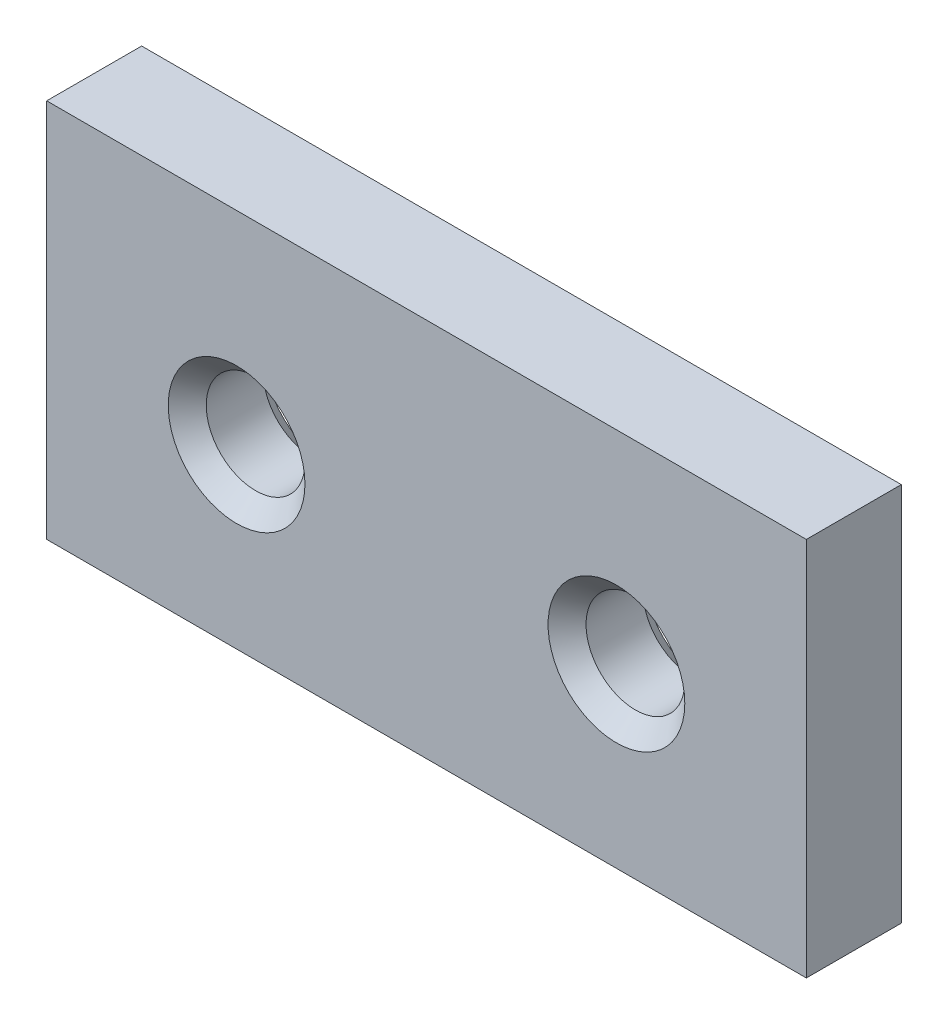
ISO-10303-21;
HEADER;
FILE_DESCRIPTION(('STEP AP214'),'2;1');
FILE_NAME('part.step','',(''),(''),'','','');
FILE_SCHEMA(('AUTOMOTIVE_DESIGN { 1 0 10303 214 1 1 1 1 }'));
ENDSEC;
DATA;
#1=APPLICATION_CONTEXT('core data for automotive mechanical design processes');
#2=APPLICATION_PROTOCOL_DEFINITION('international standard','automotive_design',2000,#1);
#3=PRODUCT_CONTEXT('',#1,'mechanical');
#4=PRODUCT('Part','Part','',(#3));
#5=PRODUCT_RELATED_PRODUCT_CATEGORY('part','',(#4));
#6=PRODUCT_DEFINITION_FORMATION('','',#4);
#7=PRODUCT_DEFINITION_CONTEXT('part definition',#1,'design');
#8=PRODUCT_DEFINITION('design','',#6,#7);
#9=PRODUCT_DEFINITION_SHAPE('','',#8);
#10=(LENGTH_UNIT() NAMED_UNIT(*) SI_UNIT(.MILLI.,.METRE.));
#11=(NAMED_UNIT(*) PLANE_ANGLE_UNIT() SI_UNIT($,.RADIAN.));
#12=(NAMED_UNIT(*) SI_UNIT($,.STERADIAN.) SOLID_ANGLE_UNIT());
#13=UNCERTAINTY_MEASURE_WITH_UNIT(LENGTH_MEASURE(1.E-05),#10,'distance_accuracy_value','');
#14=(GEOMETRIC_REPRESENTATION_CONTEXT(3) GLOBAL_UNCERTAINTY_ASSIGNED_CONTEXT((#13)) GLOBAL_UNIT_ASSIGNED_CONTEXT((#10,
#11,#12)) REPRESENTATION_CONTEXT('',''));
#15=CARTESIAN_POINT('',(0.,0.,0.));
#16=DIRECTION('',(0.,0.,1.));
#17=DIRECTION('',(1.,0.,0.));
#18=AXIS2_PLACEMENT_3D('',#15,#16,#17);
#19=CARTESIAN_POINT('',(-71.2982992196035,16.0465116279069,5.));
#20=DIRECTION('',(1.,0.,0.));
#21=DIRECTION('',(0.,0.,-1.));
#22=AXIS2_PLACEMENT_3D('',#19,#20,#21);
#23=PLANE('',#22);
#24=DIRECTION('',(0.,-1.,0.));
#25=VECTOR('',#24,1.);
#26=CARTESIAN_POINT('',(-71.2982992196035,16.0465116279069,0.));
#27=LINE('',#26,#25);
#28=CARTESIAN_POINT('',(-71.2982992196035,16.0465116279069,0.));
#29=VERTEX_POINT('',#28);
#30=CARTESIAN_POINT('',(-71.2982992196035,-3.95348837209306,0.));
#31=VERTEX_POINT('',#30);
#32=EDGE_CURVE('E101',#29,#31,#27,.T.);
#33=ORIENTED_EDGE('',*,*,#32,.T.);
#34=DIRECTION('',(0.,0.,-1.));
#35=VECTOR('',#34,1.);
#36=CARTESIAN_POINT('',(-71.2982992196035,-3.95348837209306,5.));
#37=LINE('',#36,#35);
#38=CARTESIAN_POINT('',(-71.2982992196035,-3.95348837209306,5.));
#39=VERTEX_POINT('',#38);
#40=EDGE_CURVE('E92',#39,#31,#37,.T.);
#41=ORIENTED_EDGE('',*,*,#40,.F.);
#42=DIRECTION('',(0.,-1.,0.));
#43=VECTOR('',#42,1.);
#44=CARTESIAN_POINT('',(-71.2982992196035,16.0465116279069,5.));
#45=LINE('',#44,#43);
#46=CARTESIAN_POINT('',(-71.2982992196035,16.0465116279069,5.));
#47=VERTEX_POINT('',#46);
#48=EDGE_CURVE('E86',#47,#39,#45,.T.);
#49=ORIENTED_EDGE('',*,*,#48,.F.);
#50=DIRECTION('',(0.,0.,-1.));
#51=VECTOR('',#50,1.);
#52=CARTESIAN_POINT('',(-71.2982992196035,16.0465116279069,5.));
#53=LINE('',#52,#51);
#54=EDGE_CURVE('E97',#47,#29,#53,.T.);
#55=ORIENTED_EDGE('',*,*,#54,.T.);
#56=EDGE_LOOP('',(#33,#41,#49,#55));
#57=FACE_BOUND('',#56,.T.);
#58=ADVANCED_FACE('F33',(#57),#23,.F.);
#59=CARTESIAN_POINT('',(-71.2982992196035,-3.95348837209306,5.));
#60=DIRECTION('',(0.,1.,0.));
#61=DIRECTION('',(0.,0.,1.));
#62=AXIS2_PLACEMENT_3D('',#59,#60,#61);
#63=PLANE('',#62);
#64=DIRECTION('',(1.,0.,0.));
#65=VECTOR('',#64,1.);
#66=CARTESIAN_POINT('',(-71.2982992196035,-3.95348837209306,0.));
#67=LINE('',#66,#65);
#68=CARTESIAN_POINT('',(-31.2982992196035,-3.95348837209306,0.));
#69=VERTEX_POINT('',#68);
#70=EDGE_CURVE('E91',#31,#69,#67,.T.);
#71=ORIENTED_EDGE('',*,*,#70,.T.);
#72=DIRECTION('',(0.,0.,-1.));
#73=VECTOR('',#72,1.);
#74=CARTESIAN_POINT('',(-31.2982992196035,-3.95348837209306,5.));
#75=LINE('',#74,#73);
#76=CARTESIAN_POINT('',(-31.2982992196035,-3.95348837209306,5.));
#77=VERTEX_POINT('',#76);
#78=EDGE_CURVE('E89',#77,#69,#75,.T.);
#79=ORIENTED_EDGE('',*,*,#78,.F.);
#80=DIRECTION('',(1.,0.,0.));
#81=VECTOR('',#80,1.);
#82=CARTESIAN_POINT('',(-71.2982992196035,-3.95348837209306,5.));
#83=LINE('',#82,#81);
#84=EDGE_CURVE('E81',#39,#77,#83,.T.);
#85=ORIENTED_EDGE('',*,*,#84,.F.);
#86=ORIENTED_EDGE('',*,*,#40,.T.);
#87=EDGE_LOOP('',(#71,#79,#85,#86));
#88=FACE_BOUND('',#87,.T.);
#89=ADVANCED_FACE('F90',(#88),#63,.F.);
#90=CARTESIAN_POINT('',(-31.2982992196035,16.0465116279069,5.));
#91=DIRECTION('',(-1.,0.,0.));
#92=DIRECTION('',(0.,-1.,0.));
#93=AXIS2_PLACEMENT_3D('',#90,#91,#92);
#94=PLANE('',#93);
#95=DIRECTION('',(0.,1.,0.));
#96=VECTOR('',#95,1.);
#97=CARTESIAN_POINT('',(-31.2982992196035,16.0465116279069,0.));
#98=LINE('',#97,#96);
#99=CARTESIAN_POINT('',(-31.2982992196035,16.0465116279069,0.));
#100=VERTEX_POINT('',#99);
#101=EDGE_CURVE('E67',#69,#100,#98,.T.);
#102=ORIENTED_EDGE('',*,*,#101,.T.);
#103=DIRECTION('',(0.,0.,-1.));
#104=VECTOR('',#103,1.);
#105=CARTESIAN_POINT('',(-31.2982992196035,16.0465116279069,5.));
#106=LINE('',#105,#104);
#107=CARTESIAN_POINT('',(-31.2982992196035,16.0465116279069,5.));
#108=VERTEX_POINT('',#107);
#109=EDGE_CURVE('E93',#108,#100,#106,.T.);
#110=ORIENTED_EDGE('',*,*,#109,.F.);
#111=DIRECTION('',(0.,1.,0.));
#112=VECTOR('',#111,1.);
#113=CARTESIAN_POINT('',(-31.2982992196035,16.0465116279069,5.));
#114=LINE('',#113,#112);
#115=EDGE_CURVE('E84',#77,#108,#114,.T.);
#116=ORIENTED_EDGE('',*,*,#115,.F.);
#117=ORIENTED_EDGE('',*,*,#78,.T.);
#118=EDGE_LOOP('',(#102,#110,#116,#117));
#119=FACE_BOUND('',#118,.T.);
#120=ADVANCED_FACE('F95',(#119),#94,.F.);
#121=CARTESIAN_POINT('',(-71.2982992196035,16.0465116279069,5.));
#122=DIRECTION('',(0.,-1.,0.));
#123=DIRECTION('',(0.,0.,-1.));
#124=AXIS2_PLACEMENT_3D('',#121,#122,#123);
#125=PLANE('',#124);
#126=DIRECTION('',(-1.,0.,0.));
#127=VECTOR('',#126,1.);
#128=CARTESIAN_POINT('',(-71.2982992196035,16.0465116279069,0.));
#129=LINE('',#128,#127);
#130=EDGE_CURVE('E73',#100,#29,#129,.T.);
#131=ORIENTED_EDGE('',*,*,#130,.T.);
#132=ORIENTED_EDGE('',*,*,#54,.F.);
#133=DIRECTION('',(-1.,0.,0.));
#134=VECTOR('',#133,1.);
#135=CARTESIAN_POINT('',(-71.2982992196035,16.0465116279069,5.));
#136=LINE('',#135,#134);
#137=EDGE_CURVE('E50',#108,#47,#136,.T.);
#138=ORIENTED_EDGE('',*,*,#137,.F.);
#139=ORIENTED_EDGE('',*,*,#109,.T.);
#140=EDGE_LOOP('',(#131,#132,#138,#139));
#141=FACE_BOUND('',#140,.T.);
#142=ADVANCED_FACE('F177',(#141),#125,.F.);
#143=CARTESIAN_POINT('',(0.,0.,5.));
#144=DIRECTION('',(0.,0.,1.));
#145=DIRECTION('',(1.,0.,0.));
#146=AXIS2_PLACEMENT_3D('',#143,#144,#145);
#147=PLANE('',#146);
#148=CARTESIAN_POINT('',(-41.2982992196035,5.36713741653622,5.));
#149=DIRECTION('',(0.,0.,1.));
#150=DIRECTION('',(1.,0.,0.));
#151=AXIS2_PLACEMENT_3D('',#148,#149,#150);
#152=CIRCLE('',#151,3.6);
#153=CARTESIAN_POINT('',(-37.6982992196035,5.36713741653622,5.));
#154=VERTEX_POINT('',#153);
#155=EDGE_CURVE('E11',#154,#154,#152,.F.);
#156=ORIENTED_EDGE('',*,*,#155,.T.);
#157=EDGE_LOOP('',(#156));
#158=FACE_BOUND('',#157,.T.);
#159=CARTESIAN_POINT('',(-61.2982992196035,5.36713741653622,5.));
#160=DIRECTION('',(0.,0.,1.));
#161=DIRECTION('',(1.,0.,0.));
#162=AXIS2_PLACEMENT_3D('',#159,#160,#161);
#163=CIRCLE('',#162,3.59999999999999);
#164=CARTESIAN_POINT('',(-57.6982992196035,5.36713741653622,5.));
#165=VERTEX_POINT('',#164);
#166=EDGE_CURVE('E42',#165,#165,#163,.F.);
#167=ORIENTED_EDGE('',*,*,#166,.T.);
#168=EDGE_LOOP('',(#167));
#169=FACE_BOUND('',#168,.T.);
#170=ORIENTED_EDGE('',*,*,#48,.T.);
#171=ORIENTED_EDGE('',*,*,#84,.T.);
#172=ORIENTED_EDGE('',*,*,#115,.T.);
#173=ORIENTED_EDGE('',*,*,#137,.T.);
#174=EDGE_LOOP('',(#170,#171,#172,#173));
#175=FACE_BOUND('',#174,.T.);
#176=ADVANCED_FACE('F82',(#158,#169,#175),#147,.T.);
#177=CARTESIAN_POINT('',(0.,0.,0.));
#178=DIRECTION('',(0.,0.,1.));
#179=DIRECTION('',(1.,0.,0.));
#180=AXIS2_PLACEMENT_3D('',#177,#178,#179);
#181=PLANE('',#180);
#182=CARTESIAN_POINT('',(-61.2982992196035,5.36713741653622,0.));
#183=DIRECTION('',(0.,0.,1.));
#184=DIRECTION('',(1.,0.,0.));
#185=AXIS2_PLACEMENT_3D('',#182,#183,#184);
#186=CIRCLE('',#185,3.59999999999999);
#187=CARTESIAN_POINT('',(-57.6982992196035,5.36713741653622,0.));
#188=VERTEX_POINT('',#187);
#189=EDGE_CURVE('E113',#188,#188,#186,.T.);
#190=ORIENTED_EDGE('',*,*,#189,.T.);
#191=EDGE_LOOP('',(#190));
#192=FACE_BOUND('',#191,.T.);
#193=CARTESIAN_POINT('',(-41.2982992196035,5.36713741653622,0.));
#194=DIRECTION('',(0.,0.,1.));
#195=DIRECTION('',(1.,0.,0.));
#196=AXIS2_PLACEMENT_3D('',#193,#194,#195);
#197=CIRCLE('',#196,3.59999999999999);
#198=CARTESIAN_POINT('',(-37.6982992196035,5.36713741653622,0.));
#199=VERTEX_POINT('',#198);
#200=EDGE_CURVE('E110',#199,#199,#197,.T.);
#201=ORIENTED_EDGE('',*,*,#200,.T.);
#202=EDGE_LOOP('',(#201));
#203=FACE_BOUND('',#202,.T.);
#204=ORIENTED_EDGE('',*,*,#32,.F.);
#205=ORIENTED_EDGE('',*,*,#130,.F.);
#206=ORIENTED_EDGE('',*,*,#101,.F.);
#207=ORIENTED_EDGE('',*,*,#70,.F.);
#208=EDGE_LOOP('',(#204,#205,#206,#207));
#209=FACE_BOUND('',#208,.T.);
#210=ADVANCED_FACE('F139',(#192,#203,#209),#181,.F.);
#211=CARTESIAN_POINT('',(-61.2982992196035,5.36713741653622,0.));
#212=DIRECTION('',(0.,0.,1.));
#213=DIRECTION('',(1.,0.,0.));
#214=AXIS2_PLACEMENT_3D('',#211,#212,#213);
#215=CYLINDRICAL_SURFACE('',#214,2.6);
#216=CARTESIAN_POINT('',(-61.2982992196035,5.36713741653622,1.));
#217=DIRECTION('',(0.,0.,1.));
#218=DIRECTION('',(1.,0.,0.));
#219=AXIS2_PLACEMENT_3D('',#216,#217,#218);
#220=CIRCLE('',#219,2.6);
#221=CARTESIAN_POINT('',(-58.6982992196035,5.36713741653622,1.));
#222=VERTEX_POINT('',#221);
#223=EDGE_CURVE('E119',#222,#222,#220,.F.);
#224=ORIENTED_EDGE('',*,*,#223,.T.);
#225=EDGE_LOOP('',(#224));
#226=FACE_BOUND('',#225,.T.);
#227=CARTESIAN_POINT('',(-61.2982992196035,5.36713741653622,4.));
#228=DIRECTION('',(0.,0.,1.));
#229=DIRECTION('',(1.,0.,0.));
#230=AXIS2_PLACEMENT_3D('',#227,#228,#229);
#231=CIRCLE('',#230,2.6);
#232=CARTESIAN_POINT('',(-58.6982992196035,5.36713741653622,4.));
#233=VERTEX_POINT('',#232);
#234=EDGE_CURVE('E116',#233,#233,#231,.T.);
#235=ORIENTED_EDGE('',*,*,#234,.T.);
#236=EDGE_LOOP('',(#235));
#237=FACE_BOUND('',#236,.T.);
#238=ADVANCED_FACE('F136',(#226,#237),#215,.F.);
#239=CARTESIAN_POINT('',(-41.2982992196035,5.36713741653622,0.));
#240=DIRECTION('',(0.,0.,1.));
#241=DIRECTION('',(1.,0.,0.));
#242=AXIS2_PLACEMENT_3D('',#239,#240,#241);
#243=CYLINDRICAL_SURFACE('',#242,2.6);
#244=CARTESIAN_POINT('',(-41.2982992196035,5.36713741653622,1.));
#245=DIRECTION('',(0.,0.,1.));
#246=DIRECTION('',(1.,0.,0.));
#247=AXIS2_PLACEMENT_3D('',#244,#245,#246);
#248=CIRCLE('',#247,2.6);
#249=CARTESIAN_POINT('',(-38.6982992196035,5.36713741653622,1.));
#250=VERTEX_POINT('',#249);
#251=EDGE_CURVE('E125',#250,#250,#248,.F.);
#252=ORIENTED_EDGE('',*,*,#251,.T.);
#253=EDGE_LOOP('',(#252));
#254=FACE_BOUND('',#253,.T.);
#255=CARTESIAN_POINT('',(-41.2982992196035,5.36713741653622,4.));
#256=DIRECTION('',(0.,0.,1.));
#257=DIRECTION('',(1.,0.,0.));
#258=AXIS2_PLACEMENT_3D('',#255,#256,#257);
#259=CIRCLE('',#258,2.6);
#260=CARTESIAN_POINT('',(-38.6982992196035,5.36713741653622,4.));
#261=VERTEX_POINT('',#260);
#262=EDGE_CURVE('E122',#261,#261,#259,.T.);
#263=ORIENTED_EDGE('',*,*,#262,.T.);
#264=EDGE_LOOP('',(#263));
#265=FACE_BOUND('',#264,.T.);
#266=ADVANCED_FACE('F138',(#254,#265),#243,.F.);
#267=CARTESIAN_POINT('',(-61.2982992196035,5.36713741653622,0.));
#268=DIRECTION('',(0.,0.,-1.));
#269=DIRECTION('',(-1.,0.,0.));
#270=AXIS2_PLACEMENT_3D('',#267,#268,#269);
#271=CONICAL_SURFACE('',#270,3.59999999999999,0.785398163397446);
#272=ORIENTED_EDGE('',*,*,#223,.F.);
#273=EDGE_LOOP('',(#272));
#274=FACE_BOUND('',#273,.T.);
#275=ORIENTED_EDGE('',*,*,#189,.F.);
#276=EDGE_LOOP('',(#275));
#277=FACE_BOUND('',#276,.T.);
#278=ADVANCED_FACE('F146',(#274,#277),#271,.F.);
#279=CARTESIAN_POINT('',(-41.2982992196035,5.36713741653622,0.));
#280=DIRECTION('',(0.,0.,-1.));
#281=DIRECTION('',(-1.,0.,0.));
#282=AXIS2_PLACEMENT_3D('',#279,#280,#281);
#283=CONICAL_SURFACE('',#282,3.59999999999999,0.785398163397444);
#284=ORIENTED_EDGE('',*,*,#251,.F.);
#285=EDGE_LOOP('',(#284));
#286=FACE_BOUND('',#285,.T.);
#287=ORIENTED_EDGE('',*,*,#200,.F.);
#288=EDGE_LOOP('',(#287));
#289=FACE_BOUND('',#288,.T.);
#290=ADVANCED_FACE('F163',(#286,#289),#283,.F.);
#291=CARTESIAN_POINT('',(-41.2982992196035,5.36713741653622,4.));
#292=DIRECTION('',(0.,0.,1.));
#293=DIRECTION('',(1.,0.,0.));
#294=AXIS2_PLACEMENT_3D('',#291,#292,#293);
#295=CONICAL_SURFACE('',#294,2.6,0.785398163397451);
#296=ORIENTED_EDGE('',*,*,#155,.F.);
#297=EDGE_LOOP('',(#296));
#298=FACE_BOUND('',#297,.T.);
#299=ORIENTED_EDGE('',*,*,#262,.F.);
#300=EDGE_LOOP('',(#299));
#301=FACE_BOUND('',#300,.T.);
#302=ADVANCED_FACE('F133',(#298,#301),#295,.F.);
#303=CARTESIAN_POINT('',(-61.2982992196035,5.36713741653622,4.));
#304=DIRECTION('',(0.,0.,1.));
#305=DIRECTION('',(1.,0.,0.));
#306=AXIS2_PLACEMENT_3D('',#303,#304,#305);
#307=CONICAL_SURFACE('',#306,2.6,0.785398163397447);
#308=ORIENTED_EDGE('',*,*,#166,.F.);
#309=EDGE_LOOP('',(#308));
#310=FACE_BOUND('',#309,.T.);
#311=ORIENTED_EDGE('',*,*,#234,.F.);
#312=EDGE_LOOP('',(#311));
#313=FACE_BOUND('',#312,.T.);
#314=ADVANCED_FACE('F35',(#310,#313),#307,.F.);
#315=CLOSED_SHELL('',(#58,#89,#120,#142,#176,#210,#238,#266,#278,#290,#302,#314));
#316=MANIFOLD_SOLID_BREP('B2',#315);
#317=ADVANCED_BREP_SHAPE_REPRESENTATION('',(#18,#316),#14);
#318=SHAPE_DEFINITION_REPRESENTATION(#9,#317);
ENDSEC;
END-ISO-10303-21;
